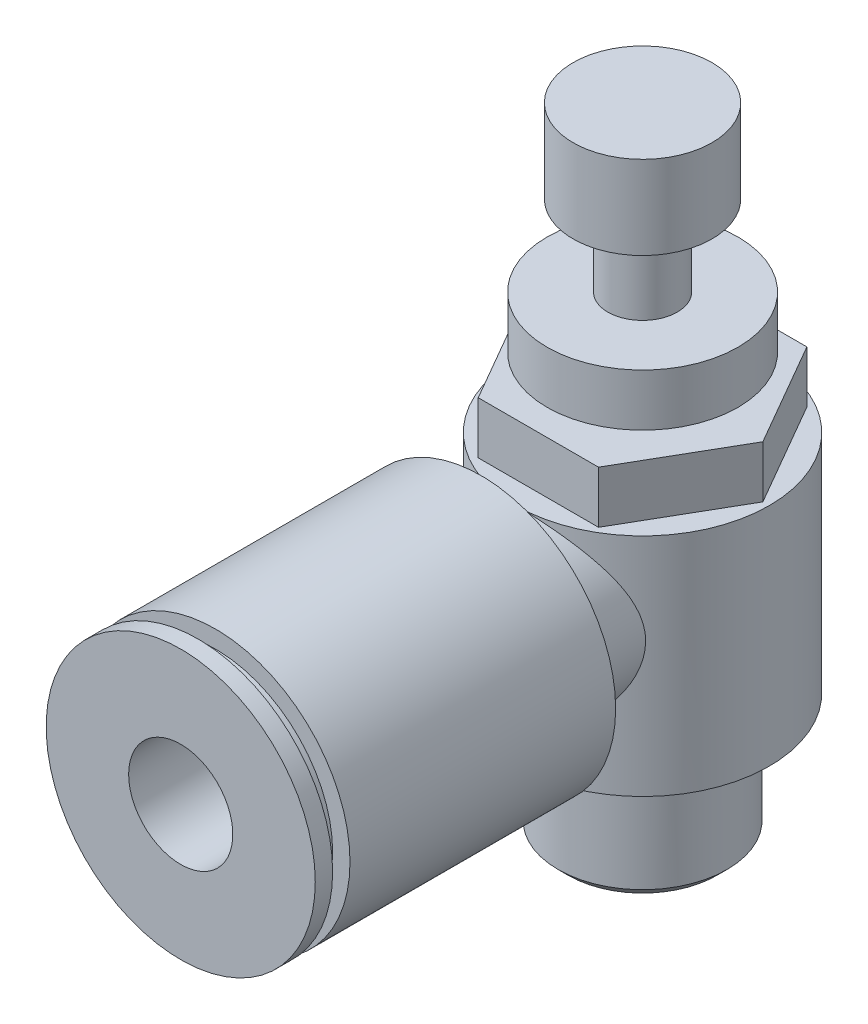
ISO-10303-21;
HEADER;
FILE_DESCRIPTION(('STEP AP214'),'2;1');
FILE_NAME('part.step','',(''),(''),'','','');
FILE_SCHEMA(('AUTOMOTIVE_DESIGN { 1 0 10303 214 1 1 1 1 }'));
ENDSEC;
DATA;
#1=APPLICATION_CONTEXT('core data for automotive mechanical design processes');
#2=APPLICATION_PROTOCOL_DEFINITION('international standard','automotive_design',2000,#1);
#3=PRODUCT_CONTEXT('',#1,'mechanical');
#4=PRODUCT('Part','Part','',(#3));
#5=PRODUCT_RELATED_PRODUCT_CATEGORY('part','',(#4));
#6=PRODUCT_DEFINITION_FORMATION('','',#4);
#7=PRODUCT_DEFINITION_CONTEXT('part definition',#1,'design');
#8=PRODUCT_DEFINITION('design','',#6,#7);
#9=PRODUCT_DEFINITION_SHAPE('','',#8);
#10=(LENGTH_UNIT() NAMED_UNIT(*) SI_UNIT(.MILLI.,.METRE.));
#11=(NAMED_UNIT(*) PLANE_ANGLE_UNIT() SI_UNIT($,.RADIAN.));
#12=(NAMED_UNIT(*) SI_UNIT($,.STERADIAN.) SOLID_ANGLE_UNIT());
#13=UNCERTAINTY_MEASURE_WITH_UNIT(LENGTH_MEASURE(1.E-05),#10,'distance_accuracy_value','');
#14=(GEOMETRIC_REPRESENTATION_CONTEXT(3) GLOBAL_UNCERTAINTY_ASSIGNED_CONTEXT((#13)) GLOBAL_UNIT_ASSIGNED_CONTEXT((#10,
#11,#12)) REPRESENTATION_CONTEXT('',''));
#15=CARTESIAN_POINT('',(0.,0.,0.));
#16=DIRECTION('',(0.,0.,1.));
#17=DIRECTION('',(1.,0.,0.));
#18=AXIS2_PLACEMENT_3D('',#15,#16,#17);
#19=CARTESIAN_POINT('',(4.04800210819405,21.7,4.));
#20=DIRECTION('',(0.,1.,0.));
#21=DIRECTION('',(0.,0.,-1.));
#22=AXIS2_PLACEMENT_3D('',#19,#20,#21);
#23=PLANE('',#22);
#24=CARTESIAN_POINT('',(0.,21.7,0.));
#25=DIRECTION('',(0.,-1.,0.));
#26=DIRECTION('',(0.,0.,-1.));
#27=AXIS2_PLACEMENT_3D('',#24,#25,#26);
#28=CIRCLE('',#27,4.);
#29=CARTESIAN_POINT('',(0.,21.7,-4.));
#30=VERTEX_POINT('',#29);
#31=EDGE_CURVE('E19',#30,#30,#28,.T.);
#32=ORIENTED_EDGE('',*,*,#31,.F.);
#33=EDGE_LOOP('',(#32));
#34=FACE_BOUND('',#33,.T.);
#35=ADVANCED_FACE('F16',(#34),#23,.T.);
#36=CARTESIAN_POINT('',(0.,16.9,0.));
#37=DIRECTION('',(0.,-1.,0.));
#38=DIRECTION('',(0.,0.,-1.));
#39=AXIS2_PLACEMENT_3D('',#36,#37,#38);
#40=CYLINDRICAL_SURFACE('',#39,4.);
#41=CARTESIAN_POINT('',(0.,16.9,0.));
#42=DIRECTION('',(0.,-1.,0.));
#43=DIRECTION('',(0.,0.,-1.));
#44=AXIS2_PLACEMENT_3D('',#41,#42,#43);
#45=CIRCLE('',#44,4.);
#46=CARTESIAN_POINT('',(0.,16.9,-4.));
#47=VERTEX_POINT('',#46);
#48=EDGE_CURVE('E210',#47,#47,#45,.T.);
#49=ORIENTED_EDGE('',*,*,#48,.F.);
#50=EDGE_LOOP('',(#49));
#51=FACE_BOUND('',#50,.T.);
#52=ORIENTED_EDGE('',*,*,#31,.T.);
#53=EDGE_LOOP('',(#52));
#54=FACE_BOUND('',#53,.T.);
#55=ADVANCED_FACE('F116',(#51,#54),#40,.T.);
#56=CARTESIAN_POINT('',(-3.06,-3.,9.6));
#57=CARTESIAN_POINT('',(-3.,-3.,9.6));
#58=CARTESIAN_POINT('',(3.,-3.,9.6));
#59=CARTESIAN_POINT('',(3.0606,-3.,9.6));
#60=B_SPLINE_CURVE_WITH_KNOTS('',1,(#56,#57,#58,#59),.UNSPECIFIED.,.F.,.F.,(2,1,1,2),(-0.01,0.,
1.,1.0101),.UNSPECIFIED.);
#61=DIRECTION('',(0.,1.,0.));
#62=VECTOR('',#61,1.);
#63=SURFACE_OF_LINEAR_EXTRUSION('',#60,#62);
#64=CARTESIAN_POINT('',(0.,0.,9.6));
#65=DIRECTION('',(0.,0.,-1.));
#66=DIRECTION('',(-1.,0.,0.));
#67=AXIS2_PLACEMENT_3D('',#64,#65,#66);
#68=CIRCLE('',#67,3.);
#69=CARTESIAN_POINT('',(-3.00000000000001,0.,9.6));
#70=VERTEX_POINT('',#69);
#71=EDGE_CURVE('E208',#70,#70,#68,.T.);
#72=ORIENTED_EDGE('',*,*,#71,.F.);
#73=EDGE_LOOP('',(#72));
#74=FACE_BOUND('',#73,.T.);
#75=ADVANCED_FACE('F112',(#74),#63,.T.);
#76=CARTESIAN_POINT('',(4.04800210819405,16.9,-4.));
#77=DIRECTION('',(0.,-1.,0.));
#78=DIRECTION('',(0.,0.,1.));
#79=AXIS2_PLACEMENT_3D('',#76,#77,#78);
#80=PLANE('',#79);
#81=CARTESIAN_POINT('',(0.,16.9,0.));
#82=DIRECTION('',(0.,-1.,0.));
#83=DIRECTION('',(1.,0.,0.));
#84=AXIS2_PLACEMENT_3D('',#81,#82,#83);
#85=CIRCLE('',#84,2.);
#86=CARTESIAN_POINT('',(2.,16.9,0.));
#87=VERTEX_POINT('',#86);
#88=EDGE_CURVE('E205',#87,#87,#85,.T.);
#89=ORIENTED_EDGE('',*,*,#88,.F.);
#90=EDGE_LOOP('',(#89));
#91=FACE_BOUND('',#90,.T.);
#92=ORIENTED_EDGE('',*,*,#48,.T.);
#93=EDGE_LOOP('',(#92));
#94=FACE_BOUND('',#93,.T.);
#95=ADVANCED_FACE('F115',(#91,#94),#80,.T.);
#96=CARTESIAN_POINT('',(0.,0.,26.6));
#97=DIRECTION('',(0.,0.,-1.));
#98=DIRECTION('',(-1.,0.,0.));
#99=AXIS2_PLACEMENT_3D('',#96,#97,#98);
#100=CYLINDRICAL_SURFACE('',#99,3.);
#101=CARTESIAN_POINT('',(0.,0.,26.6));
#102=DIRECTION('',(0.,0.,-1.));
#103=DIRECTION('',(-1.,0.,0.));
#104=AXIS2_PLACEMENT_3D('',#101,#102,#103);
#105=CIRCLE('',#104,3.);
#106=CARTESIAN_POINT('',(-3.,0.,26.6));
#107=VERTEX_POINT('',#106);
#108=EDGE_CURVE('E202',#107,#107,#105,.T.);
#109=ORIENTED_EDGE('',*,*,#108,.F.);
#110=EDGE_LOOP('',(#109));
#111=FACE_BOUND('',#110,.T.);
#112=ORIENTED_EDGE('',*,*,#71,.T.);
#113=EDGE_LOOP('',(#112));
#114=FACE_BOUND('',#113,.T.);
#115=ADVANCED_FACE('F216',(#111,#114),#100,.F.);
#116=CARTESIAN_POINT('',(0.,12.25,0.));
#117=DIRECTION('',(0.,-1.,0.));
#118=DIRECTION('',(1.,0.,0.));
#119=AXIS2_PLACEMENT_3D('',#116,#117,#118);
#120=CYLINDRICAL_SURFACE('',#119,2.);
#121=CARTESIAN_POINT('',(0.,12.25,0.));
#122=DIRECTION('',(0.,-1.,0.));
#123=DIRECTION('',(1.,0.,0.));
#124=AXIS2_PLACEMENT_3D('',#121,#122,#123);
#125=CIRCLE('',#124,2.);
#126=CARTESIAN_POINT('',(2.,12.25,0.));
#127=VERTEX_POINT('',#126);
#128=EDGE_CURVE('E199',#127,#127,#125,.T.);
#129=ORIENTED_EDGE('',*,*,#128,.F.);
#130=EDGE_LOOP('',(#129));
#131=FACE_BOUND('',#130,.T.);
#132=ORIENTED_EDGE('',*,*,#88,.T.);
#133=EDGE_LOOP('',(#132));
#134=FACE_BOUND('',#133,.T.);
#135=ADVANCED_FACE('F221',(#131,#134),#120,.T.);
#136=CARTESIAN_POINT('',(7.84300210826893,-7.75,26.6));
#137=DIRECTION('',(0.,0.,1.));
#138=DIRECTION('',(0.,1.,0.));
#139=AXIS2_PLACEMENT_3D('',#136,#137,#138);
#140=PLANE('',#139);
#141=ORIENTED_EDGE('',*,*,#108,.T.);
#142=EDGE_LOOP('',(#141));
#143=FACE_BOUND('',#142,.T.);
#144=CARTESIAN_POINT('',(0.,0.,26.6));
#145=DIRECTION('',(0.,0.,1.));
#146=DIRECTION('',(1.,0.,0.));
#147=AXIS2_PLACEMENT_3D('',#144,#145,#146);
#148=CIRCLE('',#147,7.75);
#149=CARTESIAN_POINT('',(7.75,0.,26.6));
#150=VERTEX_POINT('',#149);
#151=EDGE_CURVE('E196',#150,#150,#148,.F.);
#152=ORIENTED_EDGE('',*,*,#151,.F.);
#153=EDGE_LOOP('',(#152));
#154=FACE_BOUND('',#153,.T.);
#155=ADVANCED_FACE('F226',(#143,#154),#140,.T.);
#156=CARTESIAN_POINT('',(5.56600210823252,12.25,5.5));
#157=DIRECTION('',(0.,1.,0.));
#158=DIRECTION('',(0.,0.,-1.));
#159=AXIS2_PLACEMENT_3D('',#156,#157,#158);
#160=PLANE('',#159);
#161=ORIENTED_EDGE('',*,*,#128,.T.);
#162=EDGE_LOOP('',(#161));
#163=FACE_BOUND('',#162,.T.);
#164=CARTESIAN_POINT('',(0.,12.25,0.));
#165=DIRECTION('',(0.,-1.,0.));
#166=DIRECTION('',(1.,0.,0.));
#167=AXIS2_PLACEMENT_3D('',#164,#165,#166);
#168=CIRCLE('',#167,5.5);
#169=CARTESIAN_POINT('',(5.5,12.25,0.));
#170=VERTEX_POINT('',#169);
#171=EDGE_CURVE('E193',#170,#170,#168,.T.);
#172=ORIENTED_EDGE('',*,*,#171,.F.);
#173=EDGE_LOOP('',(#172));
#174=FACE_BOUND('',#173,.T.);
#175=ADVANCED_FACE('F232',(#163,#174),#160,.T.);
#176=CARTESIAN_POINT('',(0.,0.,26.6));
#177=DIRECTION('',(0.,0.,1.));
#178=DIRECTION('',(1.,0.,0.));
#179=AXIS2_PLACEMENT_3D('',#176,#177,#178);
#180=CYLINDRICAL_SURFACE('',#179,7.75);
#181=ORIENTED_EDGE('',*,*,#151,.T.);
#182=EDGE_LOOP('',(#181));
#183=FACE_BOUND('',#182,.T.);
#184=CARTESIAN_POINT('',(0.,0.,25.6));
#185=DIRECTION('',(0.,0.,1.));
#186=DIRECTION('',(1.,0.,0.));
#187=AXIS2_PLACEMENT_3D('',#184,#185,#186);
#188=CIRCLE('',#187,7.75);
#189=CARTESIAN_POINT('',(7.75,0.,25.6));
#190=VERTEX_POINT('',#189);
#191=EDGE_CURVE('E190',#190,#190,#188,.F.);
#192=ORIENTED_EDGE('',*,*,#191,.F.);
#193=EDGE_LOOP('',(#192));
#194=FACE_BOUND('',#193,.T.);
#195=ADVANCED_FACE('F239',(#183,#194),#180,.T.);
#196=CARTESIAN_POINT('',(0.,9.25,0.));
#197=DIRECTION('',(0.,-1.,0.));
#198=DIRECTION('',(1.,0.,0.));
#199=AXIS2_PLACEMENT_3D('',#196,#197,#198);
#200=CYLINDRICAL_SURFACE('',#199,5.5);
#201=CARTESIAN_POINT('',(0.,9.25,0.));
#202=DIRECTION('',(0.,-1.,0.));
#203=DIRECTION('',(1.,0.,0.));
#204=AXIS2_PLACEMENT_3D('',#201,#202,#203);
#205=CIRCLE('',#204,5.5);
#206=CARTESIAN_POINT('',(5.5,9.25,0.));
#207=VERTEX_POINT('',#206);
#208=EDGE_CURVE('E187',#207,#207,#205,.T.);
#209=ORIENTED_EDGE('',*,*,#208,.F.);
#210=EDGE_LOOP('',(#209));
#211=FACE_BOUND('',#210,.T.);
#212=ORIENTED_EDGE('',*,*,#171,.T.);
#213=EDGE_LOOP('',(#212));
#214=FACE_BOUND('',#213,.T.);
#215=ADVANCED_FACE('F243',(#211,#214),#200,.T.);
#216=CARTESIAN_POINT('',(7.84300210826894,7.75,25.6));
#217=DIRECTION('',(0.,0.,-1.));
#218=DIRECTION('',(0.,-1.,0.));
#219=AXIS2_PLACEMENT_3D('',#216,#217,#218);
#220=PLANE('',#219);
#221=CARTESIAN_POINT('',(0.,0.,25.6));
#222=DIRECTION('',(0.,0.,1.));
#223=DIRECTION('',(1.,0.,0.));
#224=AXIS2_PLACEMENT_3D('',#221,#222,#223);
#225=CIRCLE('',#224,6.75);
#226=CARTESIAN_POINT('',(6.75,0.,25.6));
#227=VERTEX_POINT('',#226);
#228=EDGE_CURVE('E184',#227,#227,#225,.F.);
#229=ORIENTED_EDGE('',*,*,#228,.F.);
#230=EDGE_LOOP('',(#229));
#231=FACE_BOUND('',#230,.T.);
#232=ORIENTED_EDGE('',*,*,#191,.T.);
#233=EDGE_LOOP('',(#232));
#234=FACE_BOUND('',#233,.T.);
#235=ADVANCED_FACE('F247',(#231,#234),#220,.T.);
#236=CARTESIAN_POINT('',(5.56600210823252,9.25,-5.5));
#237=DIRECTION('',(0.,-1.,0.));
#238=DIRECTION('',(0.,0.,1.));
#239=AXIS2_PLACEMENT_3D('',#236,#237,#238);
#240=PLANE('',#239);
#241=CARTESIAN_POINT('',(0.,9.25,0.));
#242=DIRECTION('',(0.,-1.,0.));
#243=DIRECTION('',(0.,0.,-1.));
#244=AXIS2_PLACEMENT_3D('',#241,#242,#243);
#245=CIRCLE('',#244,4.);
#246=CARTESIAN_POINT('',(0.,9.25,-4.));
#247=VERTEX_POINT('',#246);
#248=EDGE_CURVE('E181',#247,#247,#245,.T.);
#249=ORIENTED_EDGE('',*,*,#248,.F.);
#250=EDGE_LOOP('',(#249));
#251=FACE_BOUND('',#250,.T.);
#252=ORIENTED_EDGE('',*,*,#208,.T.);
#253=EDGE_LOOP('',(#252));
#254=FACE_BOUND('',#253,.T.);
#255=ADVANCED_FACE('F251',(#251,#254),#240,.T.);
#256=CARTESIAN_POINT('',(0.,0.,25.6));
#257=DIRECTION('',(0.,0.,1.));
#258=DIRECTION('',(1.,0.,0.));
#259=AXIS2_PLACEMENT_3D('',#256,#257,#258);
#260=CYLINDRICAL_SURFACE('',#259,6.75);
#261=ORIENTED_EDGE('',*,*,#228,.T.);
#262=EDGE_LOOP('',(#261));
#263=FACE_BOUND('',#262,.T.);
#264=CARTESIAN_POINT('',(0.,0.,24.6));
#265=DIRECTION('',(0.,0.,1.));
#266=DIRECTION('',(1.,0.,0.));
#267=AXIS2_PLACEMENT_3D('',#264,#265,#266);
#268=CIRCLE('',#267,6.75);
#269=CARTESIAN_POINT('',(6.75,0.,24.6));
#270=VERTEX_POINT('',#269);
#271=EDGE_CURVE('E178',#270,#270,#268,.F.);
#272=ORIENTED_EDGE('',*,*,#271,.F.);
#273=EDGE_LOOP('',(#272));
#274=FACE_BOUND('',#273,.T.);
#275=ADVANCED_FACE('F255',(#263,#274),#260,.T.);
#276=CARTESIAN_POINT('',(0.,8.25,0.));
#277=DIRECTION('',(0.,-1.,0.));
#278=DIRECTION('',(0.,0.,-1.));
#279=AXIS2_PLACEMENT_3D('',#276,#277,#278);
#280=CYLINDRICAL_SURFACE('',#279,4.);
#281=CARTESIAN_POINT('',(0.,8.25,0.));
#282=DIRECTION('',(0.,-1.,0.));
#283=DIRECTION('',(0.,0.,-1.));
#284=AXIS2_PLACEMENT_3D('',#281,#282,#283);
#285=CIRCLE('',#284,4.);
#286=CARTESIAN_POINT('',(0.,8.25,-4.));
#287=VERTEX_POINT('',#286);
#288=EDGE_CURVE('E175',#287,#287,#285,.T.);
#289=ORIENTED_EDGE('',*,*,#288,.F.);
#290=EDGE_LOOP('',(#289));
#291=FACE_BOUND('',#290,.T.);
#292=ORIENTED_EDGE('',*,*,#248,.T.);
#293=EDGE_LOOP('',(#292));
#294=FACE_BOUND('',#293,.T.);
#295=ADVANCED_FACE('F259',(#291,#294),#280,.T.);
#296=CARTESIAN_POINT('',(7.84300210826893,-7.75,24.6));
#297=DIRECTION('',(0.,0.,1.));
#298=DIRECTION('',(0.,1.,0.));
#299=AXIS2_PLACEMENT_3D('',#296,#297,#298);
#300=PLANE('',#299);
#301=ORIENTED_EDGE('',*,*,#271,.T.);
#302=EDGE_LOOP('',(#301));
#303=FACE_BOUND('',#302,.T.);
#304=CARTESIAN_POINT('',(0.,0.,24.6));
#305=DIRECTION('',(0.,0.,1.));
#306=DIRECTION('',(1.,0.,0.));
#307=AXIS2_PLACEMENT_3D('',#304,#305,#306);
#308=CIRCLE('',#307,7.75);
#309=CARTESIAN_POINT('',(7.75,0.,24.6));
#310=VERTEX_POINT('',#309);
#311=EDGE_CURVE('E93',#310,#310,#308,.F.);
#312=ORIENTED_EDGE('',*,*,#311,.F.);
#313=EDGE_LOOP('',(#312));
#314=FACE_BOUND('',#313,.T.);
#315=ADVANCED_FACE('F263',(#303,#314),#300,.T.);
#316=CARTESIAN_POINT('',(-7.01134166903882,8.25,-6.));
#317=DIRECTION('',(0.,1.,0.));
#318=DIRECTION('',(0.,0.,1.));
#319=AXIS2_PLACEMENT_3D('',#316,#317,#318);
#320=PLANE('',#319);
#321=ORIENTED_EDGE('',*,*,#288,.T.);
#322=EDGE_LOOP('',(#321));
#323=FACE_BOUND('',#322,.T.);
#324=DIRECTION('',(-1.,0.,0.));
#325=VECTOR('',#324,1.);
#326=CARTESIAN_POINT('',(0.,8.25,6.));
#327=LINE('',#326,#325);
#328=CARTESIAN_POINT('',(3.46410161513775,8.25,6.));
#329=VERTEX_POINT('',#328);
#330=CARTESIAN_POINT('',(-3.46410161513775,8.25,6.));
#331=VERTEX_POINT('',#330);
#332=EDGE_CURVE('E81',#329,#331,#327,.T.);
#333=ORIENTED_EDGE('',*,*,#332,.F.);
#334=DIRECTION('',(-0.5,0.,0.866025403784438));
#335=VECTOR('',#334,1.);
#336=CARTESIAN_POINT('',(5.19615242270663,8.25,3.));
#337=LINE('',#336,#335);
#338=CARTESIAN_POINT('',(6.92820310527251,8.25,-2.16511547189088E-07));
#339=VERTEX_POINT('',#338);
#340=EDGE_CURVE('E75',#339,#329,#337,.T.);
#341=ORIENTED_EDGE('',*,*,#340,.F.);
#342=DIRECTION('',(0.5,0.,0.866025403784438));
#343=VECTOR('',#342,1.);
#344=CARTESIAN_POINT('',(5.19615242270663,8.25,-3.));
#345=LINE('',#344,#343);
#346=CARTESIAN_POINT('',(3.46410161513775,8.25,-6.));
#347=VERTEX_POINT('',#346);
#348=EDGE_CURVE('E78',#347,#339,#345,.T.);
#349=ORIENTED_EDGE('',*,*,#348,.F.);
#350=DIRECTION('',(1.,0.,0.));
#351=VECTOR('',#350,1.);
#352=CARTESIAN_POINT('',(0.,8.25,-6.));
#353=LINE('',#352,#351);
#354=CARTESIAN_POINT('',(-3.46410161513775,8.25,-6.));
#355=VERTEX_POINT('',#354);
#356=EDGE_CURVE('E352',#355,#347,#353,.T.);
#357=ORIENTED_EDGE('',*,*,#356,.F.);
#358=DIRECTION('',(0.5,0.,-0.866025403784438));
#359=VECTOR('',#358,1.);
#360=CARTESIAN_POINT('',(-5.19615242270663,8.25,-3.));
#361=LINE('',#360,#359);
#362=CARTESIAN_POINT('',(-6.92820310527251,8.25,-2.16511547405929E-07));
#363=VERTEX_POINT('',#362);
#364=EDGE_CURVE('E357',#363,#355,#361,.T.);
#365=ORIENTED_EDGE('',*,*,#364,.F.);
#366=DIRECTION('',(-0.5,0.,-0.866025403784438));
#367=VECTOR('',#366,1.);
#368=CARTESIAN_POINT('',(-5.19615242270663,8.25,3.));
#369=LINE('',#368,#367);
#370=EDGE_CURVE('E362',#331,#363,#369,.T.);
#371=ORIENTED_EDGE('',*,*,#370,.F.);
#372=EDGE_LOOP('',(#333,#341,#349,#357,#365,#371));
#373=FACE_BOUND('',#372,.T.);
#374=ADVANCED_FACE('F77',(#323,#373),#320,.T.);
#375=CARTESIAN_POINT('',(0.,0.,24.6));
#376=DIRECTION('',(0.,0.,1.));
#377=DIRECTION('',(1.,0.,0.));
#378=AXIS2_PLACEMENT_3D('',#375,#376,#377);
#379=CYLINDRICAL_SURFACE('',#378,7.75);
#380=ORIENTED_EDGE('',*,*,#311,.T.);
#381=EDGE_LOOP('',(#380));
#382=FACE_BOUND('',#381,.T.);
#383=CARTESIAN_POINT('',(0.,0.,9.3));
#384=DIRECTION('',(0.,0.,1.));
#385=DIRECTION('',(1.,0.,0.));
#386=AXIS2_PLACEMENT_3D('',#383,#384,#385);
#387=CIRCLE('',#386,7.75);
#388=CARTESIAN_POINT('',(7.75,0.,9.3));
#389=VERTEX_POINT('',#388);
#390=EDGE_CURVE('E169',#389,#389,#387,.F.);
#391=ORIENTED_EDGE('',*,*,#390,.F.);
#392=EDGE_LOOP('',(#391));
#393=FACE_BOUND('',#392,.T.);
#394=ADVANCED_FACE('F270',(#382,#393),#379,.T.);
#395=CARTESIAN_POINT('',(6.92820323027551,5.25,0.));
#396=DIRECTION('',(0.866025403784438,0.,-0.5));
#397=DIRECTION('',(-0.5,0.,-0.866025403784438));
#398=AXIS2_PLACEMENT_3D('',#395,#396,#397);
#399=PLANE('',#398);
#400=CARTESIAN_POINT('',(3.46410161513776,5.25,-6.));
#401=CARTESIAN_POINT('',(3.60843918243517,5.25,-5.75));
#402=CARTESIAN_POINT('',(3.75277674973257,5.25,-5.5));
#403=CARTESIAN_POINT('',(4.04145188432739,5.25,-5.));
#404=CARTESIAN_POINT('',(4.18578945162479,5.25,-4.75));
#405=CARTESIAN_POINT('',(4.4744645862196,5.25,-4.25));
#406=CARTESIAN_POINT('',(4.61880215351701,5.25,-4.));
#407=CARTESIAN_POINT('',(4.90747728811182,5.25,-3.5));
#408=CARTESIAN_POINT('',(5.05181485540923,5.25,-3.25));
#409=CARTESIAN_POINT('',(5.34048999000404,5.25,-2.75));
#410=CARTESIAN_POINT('',(5.48482755730145,5.25,-2.5));
#411=CARTESIAN_POINT('',(5.77350269189626,5.25,-2.));
#412=CARTESIAN_POINT('',(5.91784025919367,5.25,-1.75));
#413=CARTESIAN_POINT('',(6.20651539378848,5.25,-1.25));
#414=CARTESIAN_POINT('',(6.35085296108588,5.25,-0.999999999999999));
#415=CARTESIAN_POINT('',(6.6395280956807,5.25,-0.5));
#416=CARTESIAN_POINT('',(6.7838656629781,5.25,-0.250000000000001));
#417=CARTESIAN_POINT('',(6.92820323027551,5.25,0.));
#418=B_SPLINE_CURVE_WITH_KNOTS('',3,(#400,#401,#402,#403,#404,#405,#406,#407,#408,#409,#410,
#411,#412,#413,#414,#415,#416,#417),.UNSPECIFIED.,.F.,.F.,(4,2,2,2,2,2,2,2,4),(0.,
0.866025403784437,1.73205080756888,2.59807621135332,3.46410161513775,4.33012701892219,
5.19615242270663,6.06217782649107,6.92820323027551),.UNSPECIFIED.);
#419=CARTESIAN_POINT('',(3.46410161513776,5.25,-6.));
#420=VERTEX_POINT('',#419);
#421=CARTESIAN_POINT('',(6.92820316777329,5.25,-1.08257021402824E-07));
#422=VERTEX_POINT('',#421);
#423=EDGE_CURVE('E172',#420,#422,#418,.T.);
#424=ORIENTED_EDGE('',*,*,#423,.F.);
#425=DIRECTION('',(0.,1.,0.));
#426=VECTOR('',#425,1.);
#427=CARTESIAN_POINT('',(3.46410161513776,5.25,-6.));
#428=LINE('',#427,#426);
#429=EDGE_CURVE('E91',#347,#420,#428,.F.);
#430=ORIENTED_EDGE('',*,*,#429,.F.);
#431=ORIENTED_EDGE('',*,*,#348,.T.);
#432=DIRECTION('',(0.,1.,0.));
#433=VECTOR('',#432,1.);
#434=CARTESIAN_POINT('',(6.92820323027551,5.25,0.));
#435=LINE('',#434,#433);
#436=EDGE_CURVE('E85',#422,#339,#435,.T.);
#437=ORIENTED_EDGE('',*,*,#436,.F.);
#438=EDGE_LOOP('',(#424,#430,#431,#437));
#439=FACE_BOUND('',#438,.T.);
#440=ADVANCED_FACE('F88',(#439),#399,.T.);
#441=CARTESIAN_POINT('',(3.46410161513775,5.25,6.));
#442=DIRECTION('',(0.866025403784438,0.,0.5));
#443=DIRECTION('',(0.5,0.,-0.866025403784438));
#444=AXIS2_PLACEMENT_3D('',#441,#442,#443);
#445=PLANE('',#444);
#446=CARTESIAN_POINT('',(6.92820323027551,5.25,0.));
#447=CARTESIAN_POINT('',(6.7838656629781,5.25,0.25));
#448=CARTESIAN_POINT('',(6.6395280956807,5.25,0.5));
#449=CARTESIAN_POINT('',(6.35085296108588,5.25,1.));
#450=CARTESIAN_POINT('',(6.20651539378848,5.25,1.25));
#451=CARTESIAN_POINT('',(5.91784025919366,5.25,1.75));
#452=CARTESIAN_POINT('',(5.77350269189626,5.25,2.));
#453=CARTESIAN_POINT('',(5.48482755730144,5.25,2.5));
#454=CARTESIAN_POINT('',(5.34048999000404,5.25,2.75));
#455=CARTESIAN_POINT('',(5.05181485540922,5.25,3.25));
#456=CARTESIAN_POINT('',(4.90747728811182,5.25,3.5));
#457=CARTESIAN_POINT('',(4.618802153517,5.25,4.));
#458=CARTESIAN_POINT('',(4.4744645862196,5.25,4.25));
#459=CARTESIAN_POINT('',(4.18578945162478,5.25,4.75));
#460=CARTESIAN_POINT('',(4.04145188432738,5.25,5.));
#461=CARTESIAN_POINT('',(3.75277674973256,5.25,5.5));
#462=CARTESIAN_POINT('',(3.60843918243516,5.25,5.75));
#463=CARTESIAN_POINT('',(3.46410161513775,5.25,6.));
#464=B_SPLINE_CURVE_WITH_KNOTS('',3,(#446,#447,#448,#449,#450,#451,#452,#453,#454,#455,#456,
#457,#458,#459,#460,#461,#462,#463),.UNSPECIFIED.,.F.,.F.,(4,2,2,2,2,2,2,2,4),(0.,
0.866025403784439,1.73205080756888,2.59807621135332,3.46410161513776,4.3301270189222,
5.19615242270663,6.06217782649107,6.92820323027551),.UNSPECIFIED.);
#465=CARTESIAN_POINT('',(3.46410161513775,5.25,6.));
#466=VERTEX_POINT('',#465);
#467=EDGE_CURVE('E97',#422,#466,#464,.T.);
#468=ORIENTED_EDGE('',*,*,#467,.F.);
#469=ORIENTED_EDGE('',*,*,#436,.T.);
#470=ORIENTED_EDGE('',*,*,#340,.T.);
#471=DIRECTION('',(0.,1.,0.));
#472=VECTOR('',#471,1.);
#473=CARTESIAN_POINT('',(3.46410161513775,5.25,6.));
#474=LINE('',#473,#472);
#475=EDGE_CURVE('E100',#466,#329,#474,.T.);
#476=ORIENTED_EDGE('',*,*,#475,.F.);
#477=EDGE_LOOP('',(#468,#469,#470,#476));
#478=FACE_BOUND('',#477,.T.);
#479=ADVANCED_FACE('F95',(#478),#445,.T.);
#480=CARTESIAN_POINT('',(-3.46410161513776,5.25,6.));
#481=DIRECTION('',(0.,0.,1.));
#482=DIRECTION('',(1.,0.,0.));
#483=AXIS2_PLACEMENT_3D('',#480,#481,#482);
#484=PLANE('',#483);
#485=DIRECTION('',(-1.,0.,0.));
#486=VECTOR('',#485,1.);
#487=CARTESIAN_POINT('',(7.3,5.25,6.));
#488=LINE('',#487,#486);
#489=CARTESIAN_POINT('',(-3.46410161513776,5.25,6.));
#490=VERTEX_POINT('',#489);
#491=EDGE_CURVE('E322',#466,#490,#488,.T.);
#492=ORIENTED_EDGE('',*,*,#491,.F.);
#493=ORIENTED_EDGE('',*,*,#475,.T.);
#494=ORIENTED_EDGE('',*,*,#332,.T.);
#495=DIRECTION('',(0.,1.,0.));
#496=VECTOR('',#495,1.);
#497=CARTESIAN_POINT('',(-3.46410161513775,5.25,6.));
#498=LINE('',#497,#496);
#499=EDGE_CURVE('E359',#490,#331,#498,.T.);
#500=ORIENTED_EDGE('',*,*,#499,.F.);
#501=EDGE_LOOP('',(#492,#493,#494,#500));
#502=FACE_BOUND('',#501,.T.);
#503=ADVANCED_FACE('F279',(#502),#484,.T.);
#504=CARTESIAN_POINT('',(-6.92820323027551,5.25,0.));
#505=DIRECTION('',(-0.866025403784438,0.,0.5));
#506=DIRECTION('',(0.5,0.,0.866025403784438));
#507=AXIS2_PLACEMENT_3D('',#504,#505,#506);
#508=PLANE('',#507);
#509=CARTESIAN_POINT('',(-3.46410161513775,5.25,6.));
#510=CARTESIAN_POINT('',(-3.60843918243516,5.25,5.75));
#511=CARTESIAN_POINT('',(-3.75277674973256,5.25,5.5));
#512=CARTESIAN_POINT('',(-4.04145188432738,5.25,5.));
#513=CARTESIAN_POINT('',(-4.18578945162478,5.25,4.75));
#514=CARTESIAN_POINT('',(-4.4744645862196,5.25,4.25));
#515=CARTESIAN_POINT('',(-4.618802153517,5.25,4.));
#516=CARTESIAN_POINT('',(-4.90747728811182,5.25,3.5));
#517=CARTESIAN_POINT('',(-5.05181485540922,5.25,3.25));
#518=CARTESIAN_POINT('',(-5.34048999000404,5.25,2.75));
#519=CARTESIAN_POINT('',(-5.48482755730144,5.25,2.5));
#520=CARTESIAN_POINT('',(-5.77350269189626,5.25,2.));
#521=CARTESIAN_POINT('',(-5.91784025919366,5.25,1.75));
#522=CARTESIAN_POINT('',(-6.20651539378848,5.25,1.25));
#523=CARTESIAN_POINT('',(-6.35085296108588,5.25,1.));
#524=CARTESIAN_POINT('',(-6.63952809568069,5.25,0.499999999999999));
#525=CARTESIAN_POINT('',(-6.7838656629781,5.25,0.249999999999999));
#526=CARTESIAN_POINT('',(-6.92820323027551,5.25,0.));
#527=B_SPLINE_CURVE_WITH_KNOTS('',3,(#509,#510,#511,#512,#513,#514,#515,#516,#517,#518,#519,
#520,#521,#522,#523,#524,#525,#526),.UNSPECIFIED.,.F.,.F.,(4,2,2,2,2,2,2,2,4),(0.,
0.866025403784438,1.73205080756888,2.59807621135332,3.46410161513776,4.33012701892219,
5.19615242270663,6.06217782649107,6.92820323027551),.UNSPECIFIED.);
#528=CARTESIAN_POINT('',(-6.92820316777329,5.25,1.08257021402824E-07));
#529=VERTEX_POINT('',#528);
#530=EDGE_CURVE('E323',#490,#529,#527,.T.);
#531=ORIENTED_EDGE('',*,*,#530,.F.);
#532=ORIENTED_EDGE('',*,*,#499,.T.);
#533=ORIENTED_EDGE('',*,*,#370,.T.);
#534=DIRECTION('',(0.,1.,0.));
#535=VECTOR('',#534,1.);
#536=CARTESIAN_POINT('',(-6.92820323027551,5.25,0.));
#537=LINE('',#536,#535);
#538=EDGE_CURVE('E354',#529,#363,#537,.T.);
#539=ORIENTED_EDGE('',*,*,#538,.F.);
#540=EDGE_LOOP('',(#531,#532,#533,#539));
#541=FACE_BOUND('',#540,.T.);
#542=ADVANCED_FACE('F282',(#541),#508,.T.);
#543=CARTESIAN_POINT('',(-3.46410161513775,5.25,-6.));
#544=DIRECTION('',(-0.866025403784438,0.,-0.5));
#545=DIRECTION('',(-0.5,0.,0.866025403784438));
#546=AXIS2_PLACEMENT_3D('',#543,#544,#545);
#547=PLANE('',#546);
#548=CARTESIAN_POINT('',(-6.92820323027551,5.25,0.));
#549=CARTESIAN_POINT('',(-6.7838656629781,5.25,-0.25));
#550=CARTESIAN_POINT('',(-6.63952809568069,5.25,-0.5));
#551=CARTESIAN_POINT('',(-6.35085296108588,5.25,-0.999999999999999));
#552=CARTESIAN_POINT('',(-6.20651539378848,5.25,-1.25));
#553=CARTESIAN_POINT('',(-5.91784025919366,5.25,-1.75));
#554=CARTESIAN_POINT('',(-5.77350269189626,5.25,-2.));
#555=CARTESIAN_POINT('',(-5.48482755730145,5.25,-2.5));
#556=CARTESIAN_POINT('',(-5.34048999000404,5.25,-2.75));
#557=CARTESIAN_POINT('',(-5.05181485540922,5.25,-3.25));
#558=CARTESIAN_POINT('',(-4.90747728811182,5.25,-3.5));
#559=CARTESIAN_POINT('',(-4.618802153517,5.25,-4.));
#560=CARTESIAN_POINT('',(-4.4744645862196,5.25,-4.25));
#561=CARTESIAN_POINT('',(-4.18578945162479,5.25,-4.75));
#562=CARTESIAN_POINT('',(-4.04145188432738,5.25,-5.));
#563=CARTESIAN_POINT('',(-3.75277674973257,5.25,-5.5));
#564=CARTESIAN_POINT('',(-3.60843918243516,5.25,-5.75));
#565=CARTESIAN_POINT('',(-3.46410161513775,5.25,-6.));
#566=B_SPLINE_CURVE_WITH_KNOTS('',3,(#548,#549,#550,#551,#552,#553,#554,#555,#556,#557,#558,
#559,#560,#561,#562,#563,#564,#565),.UNSPECIFIED.,.F.,.F.,(4,2,2,2,2,2,2,2,4),(0.,
0.86602540378444,1.73205080756888,2.59807621135332,3.46410161513776,4.3301270189222,
5.19615242270663,6.06217782649107,6.92820323027551),.UNSPECIFIED.);
#567=CARTESIAN_POINT('',(-3.46410161513775,5.25,-6.));
#568=VERTEX_POINT('',#567);
#569=EDGE_CURVE('E332',#529,#568,#566,.T.);
#570=ORIENTED_EDGE('',*,*,#569,.F.);
#571=ORIENTED_EDGE('',*,*,#538,.T.);
#572=ORIENTED_EDGE('',*,*,#364,.T.);
#573=DIRECTION('',(0.,1.,0.));
#574=VECTOR('',#573,1.);
#575=CARTESIAN_POINT('',(-3.46410161513775,5.25,-6.));
#576=LINE('',#575,#574);
#577=EDGE_CURVE('E40',#568,#355,#576,.T.);
#578=ORIENTED_EDGE('',*,*,#577,.F.);
#579=EDGE_LOOP('',(#570,#571,#572,#578));
#580=FACE_BOUND('',#579,.T.);
#581=ADVANCED_FACE('F286',(#580),#547,.T.);
#582=CARTESIAN_POINT('',(3.46410161513776,5.25,-6.));
#583=DIRECTION('',(0.,0.,-1.));
#584=DIRECTION('',(-1.,0.,0.));
#585=AXIS2_PLACEMENT_3D('',#582,#583,#584);
#586=PLANE('',#585);
#587=DIRECTION('',(-1.,0.,0.));
#588=VECTOR('',#587,1.);
#589=CARTESIAN_POINT('',(7.3,5.25,-6.));
#590=LINE('',#589,#588);
#591=EDGE_CURVE('E168',#568,#420,#590,.F.);
#592=ORIENTED_EDGE('',*,*,#591,.F.);
#593=ORIENTED_EDGE('',*,*,#577,.T.);
#594=ORIENTED_EDGE('',*,*,#356,.T.);
#595=ORIENTED_EDGE('',*,*,#429,.T.);
#596=EDGE_LOOP('',(#592,#593,#594,#595));
#597=FACE_BOUND('',#596,.T.);
#598=ADVANCED_FACE('F290',(#597),#586,.T.);
#599=CARTESIAN_POINT('',(7.84300210826894,7.75,9.3));
#600=DIRECTION('',(0.,0.,-1.));
#601=DIRECTION('',(0.,-1.,0.));
#602=AXIS2_PLACEMENT_3D('',#599,#600,#601);
#603=PLANE('',#602);
#604=CARTESIAN_POINT('',(0.,0.,9.3));
#605=DIRECTION('',(0.,0.,1.));
#606=DIRECTION('',(1.,0.,0.));
#607=AXIS2_PLACEMENT_3D('',#604,#605,#606);
#608=CIRCLE('',#607,5.25);
#609=CARTESIAN_POINT('',(5.25,0.,9.3));
#610=VERTEX_POINT('',#609);
#611=EDGE_CURVE('E165',#610,#610,#608,.F.);
#612=ORIENTED_EDGE('',*,*,#611,.F.);
#613=EDGE_LOOP('',(#612));
#614=FACE_BOUND('',#613,.T.);
#615=ORIENTED_EDGE('',*,*,#390,.T.);
#616=EDGE_LOOP('',(#615));
#617=FACE_BOUND('',#616,.T.);
#618=ADVANCED_FACE('F293',(#614,#617),#603,.T.);
#619=CARTESIAN_POINT('',(7.38760210826612,5.25,7.3));
#620=DIRECTION('',(0.,1.,0.));
#621=DIRECTION('',(0.,0.,-1.));
#622=AXIS2_PLACEMENT_3D('',#619,#620,#621);
#623=PLANE('',#622);
#624=ORIENTED_EDGE('',*,*,#569,.T.);
#625=ORIENTED_EDGE('',*,*,#591,.T.);
#626=ORIENTED_EDGE('',*,*,#423,.T.);
#627=ORIENTED_EDGE('',*,*,#467,.T.);
#628=ORIENTED_EDGE('',*,*,#491,.T.);
#629=ORIENTED_EDGE('',*,*,#530,.T.);
#630=EDGE_LOOP('',(#624,#625,#626,#627,#628,#629));
#631=FACE_BOUND('',#630,.T.);
#632=CARTESIAN_POINT('',(0.,5.25,0.));
#633=DIRECTION('',(0.,-1.,0.));
#634=DIRECTION('',(0.,0.,-1.));
#635=AXIS2_PLACEMENT_3D('',#632,#633,#634);
#636=CIRCLE('',#635,7.3);
#637=CARTESIAN_POINT('',(0.,5.25,7.3));
#638=VERTEX_POINT('',#637);
#639=EDGE_CURVE('E163',#638,#638,#636,.T.);
#640=ORIENTED_EDGE('',*,*,#639,.F.);
#641=EDGE_LOOP('',(#640));
#642=FACE_BOUND('',#641,.T.);
#643=ADVANCED_FACE('F297',(#631,#642),#623,.T.);
#644=CARTESIAN_POINT('',(0.,0.,9.3));
#645=DIRECTION('',(0.,0.,1.));
#646=DIRECTION('',(1.,0.,0.));
#647=AXIS2_PLACEMENT_3D('',#644,#645,#646);
#648=CYLINDRICAL_SURFACE('',#647,5.25);
#649=ORIENTED_EDGE('',*,*,#611,.T.);
#650=EDGE_LOOP('',(#649));
#651=FACE_BOUND('',#650,.T.);
#652=CARTESIAN_POINT('',(0.,5.25,7.3));
#653=CARTESIAN_POINT('',(0.129550621350862,5.24999902547532,7.29999906460579));
#654=CARTESIAN_POINT('',(0.259119848122385,5.2451968979198,7.29654336509262));
#655=CARTESIAN_POINT('',(0.517240949472566,5.22606204847841,7.28280037609426));
#656=CARTESIAN_POINT('',(0.645792266927527,5.21172442935931,7.27250957624506));
#657=CARTESIAN_POINT('',(0.901012942516516,5.1737170011698,7.2453206243386));
#658=CARTESIAN_POINT('',(1.02767886855809,5.15003192616239,7.22841166410863));
#659=CARTESIAN_POINT('',(1.27804093415714,5.09368108223173,7.18837217276169));
#660=CARTESIAN_POINT('',(1.40173574521633,5.06101137432822,7.16523891292707));
#661=CARTESIAN_POINT('',(1.64455285335095,4.98737787171699,7.1134209130566));
#662=CARTESIAN_POINT('',(1.76369889441963,4.94646718433818,7.08477176880145));
#663=CARTESIAN_POINT('',(1.99761849672852,4.85672063891104,7.0224069534788));
#664=CARTESIAN_POINT('',(2.11239031599181,4.80788166341663,6.98868928982938));
#665=CARTESIAN_POINT('',(2.44917535212084,4.65030872721406,6.88091262606352));
#666=CARTESIAN_POINT('',(2.66395571743225,4.53042690771171,6.80016408082259));
#667=CARTESIAN_POINT('',(3.0895131867346,4.2529723255449,6.61840574883454));
#668=CARTESIAN_POINT('',(3.29818081698012,4.09297485824256,6.51622524928062));
#669=CARTESIAN_POINT('',(3.68768171658566,3.74588506061446,6.30398241501702));
#670=CARTESIAN_POINT('',(3.86847078612107,3.55875059923507,6.19390796153032));
#671=CARTESIAN_POINT('',(4.13293663862219,3.24114622036226,6.0185428986292));
#672=CARTESIAN_POINT('',(4.2262256466178,3.11854539342981,5.95322757446136));
#673=CARTESIAN_POINT('',(4.40211104804817,2.86491563565593,5.82437005319317));
#674=CARTESIAN_POINT('',(4.4847044787487,2.73388438452173,5.76082835120342));
#675=CARTESIAN_POINT('',(4.63855724688885,2.46381660414011,5.63768451193502));
#676=CARTESIAN_POINT('',(4.70983221702197,2.32479148394947,5.57807700859368));
#677=CARTESIAN_POINT('',(4.84047585403534,2.03887850112625,5.4650935393303));
#678=CARTESIAN_POINT('',(4.89984642810417,1.89199190275624,5.41171657579467));
#679=CARTESIAN_POINT('',(5.02435736155294,1.53776554927667,5.29673043499859));
#680=CARTESIAN_POINT('',(5.08424237574246,1.32726301710426,5.23878018695136));
#681=CARTESIAN_POINT('',(5.15432944478983,1.00378344081875,5.16952174810936));
#682=CARTESIAN_POINT('',(5.17439641691486,0.894727953841008,5.14938597288402));
#683=CARTESIAN_POINT('',(5.20766919312788,0.674575613136318,5.11573524791335));
#684=CARTESIAN_POINT('',(5.22087773906135,0.563479593588094,5.10221765249127));
#685=CARTESIAN_POINT('',(5.2402461406001,0.33923179091478,5.0823239283958));
#686=CARTESIAN_POINT('',(5.24635516639926,0.226071004433324,5.0759993054083));
#687=CARTESIAN_POINT('',(5.25122325978402,-0.000577797718331175,5.07096315637886));
#688=CARTESIAN_POINT('',(5.24998256901173,-0.114065802507713,5.07225138004367));
#689=CARTESIAN_POINT('',(5.24017599473671,-0.340437565249052,5.08238171554773));
#690=CARTESIAN_POINT('',(5.2316064931086,-0.453320997029144,5.09122755846955));
#691=CARTESIAN_POINT('',(5.20731618815556,-0.67756063406347,5.11606852179657));
#692=CARTESIAN_POINT('',(5.19159180898979,-0.788916046948013,5.13206721696068));
#693=CARTESIAN_POINT('',(5.1509303012587,-1.02283001646585,5.17289502782847));
#694=CARTESIAN_POINT('',(5.12509933198958,-1.14508619434785,5.19856692817812));
#695=CARTESIAN_POINT('',(5.06528877340727,-1.38591959266082,5.25686181836957));
#696=CARTESIAN_POINT('',(5.03130370310172,-1.50449427767262,5.28948948205823));
#697=CARTESIAN_POINT('',(4.91776596878957,-1.85423193217647,5.3959518150787));
#698=CARTESIAN_POINT('',(4.82667284947006,-2.07917484390121,5.47832068131733));
#699=CARTESIAN_POINT('',(4.65292953793719,-2.43676229649143,5.62569973684905));
#700=CARTESIAN_POINT('',(4.57791450677223,-2.57481275986681,5.6871078105096));
#701=CARTESIAN_POINT('',(4.41659244652402,-2.84264463755134,5.81327673368414));
#702=CARTESIAN_POINT('',(4.33028210067713,-2.97242360630323,5.87803856460899));
#703=CARTESIAN_POINT('',(4.14678659167348,-3.22348685294323,6.00889991452106));
#704=CARTESIAN_POINT('',(4.04959267799047,-3.34476416615758,6.07500047437914));
#705=CARTESIAN_POINT('',(3.8447094199187,-3.57838500086911,6.20669299145576));
#706=CARTESIAN_POINT('',(3.7370212013028,-3.6907294782903,6.27228500241552));
#707=CARTESIAN_POINT('',(3.51019573948585,-3.90715505612679,6.40201373914638));
#708=CARTESIAN_POINT('',(3.39094787849941,-4.01113435939351,6.46612724517661));
#709=CARTESIAN_POINT('',(3.1422878310698,-4.20877021196099,6.59055040128227));
#710=CARTESIAN_POINT('',(3.01287453344419,-4.30242563006265,6.65085963421036));
#711=CARTESIAN_POINT('',(2.74454424444036,-4.47835617349701,6.76600024691518));
#712=CARTESIAN_POINT('',(2.605642350946,-4.56064877624108,6.82084000251061));
#713=CARTESIAN_POINT('',(2.31884691822281,-4.71293766359939,6.92359179576655));
#714=CARTESIAN_POINT('',(2.17095709718265,-4.78293898696979,6.97150667081975));
#715=CARTESIAN_POINT('',(1.90600596213073,-4.89332753559847,7.04776555181852));
#716=CARTESIAN_POINT('',(1.79072231029626,-4.9367114506088,7.07798201307432));
#717=CARTESIAN_POINT('',(1.55627055609614,-5.01555657011161,7.13319804901173));
#718=CARTESIAN_POINT('',(1.4371033209938,-5.05101952976876,7.15819877933977));
#719=CARTESIAN_POINT('',(1.19581109639206,-5.11351497692977,7.20243357911112));
#720=CARTESIAN_POINT('',(1.07369308327069,-5.14056558419333,7.22168003944192));
#721=CARTESIAN_POINT('',(0.827092504516728,-5.18595436002114,7.25405877276754));
#722=CARTESIAN_POINT('',(0.702611045083011,-5.20429650485068,7.26719383615816));
#723=CARTESIAN_POINT('',(0.481751927516507,-5.22873596299686,7.28471875460584));
#724=CARTESIAN_POINT('',(0.385681225775782,-5.23670221237416,7.29044143335835));
#725=CARTESIAN_POINT('',(0.193077185139861,-5.24733511598439,7.29808277927422));
#726=CARTESIAN_POINT('',(0.0965437588614088,-5.25000072623564,7.30000069707481));
#727=CARTESIAN_POINT('',(-0.129550621350856,-5.24999902547534,7.29999906460581));
#728=CARTESIAN_POINT('',(-0.259119848122377,-5.2451968979198,7.29654336509262));
#729=CARTESIAN_POINT('',(-0.517240949472558,-5.22606204847841,7.28280037609426));
#730=CARTESIAN_POINT('',(-0.64579226692752,-5.21172442935931,7.27250957624506));
#731=CARTESIAN_POINT('',(-0.90101294251651,-5.1737170011698,7.2453206243386));
#732=CARTESIAN_POINT('',(-1.02767886855809,-5.15003192616239,7.22841166410863));
#733=CARTESIAN_POINT('',(-1.27804093415714,-5.09368108223173,7.18837217276169));
#734=CARTESIAN_POINT('',(-1.40173574521633,-5.06101137432822,7.16523891292707));
#735=CARTESIAN_POINT('',(-1.64455285335095,-4.98737787171699,7.1134209130566));
#736=CARTESIAN_POINT('',(-1.76369889441963,-4.94646718433818,7.08477176880145));
#737=CARTESIAN_POINT('',(-1.99761849672852,-4.85672063891104,7.0224069534788));
#738=CARTESIAN_POINT('',(-2.11239031599181,-4.80788166341663,6.98868928982938));
#739=CARTESIAN_POINT('',(-2.44917535212084,-4.65030872721406,6.88091262606351));
#740=CARTESIAN_POINT('',(-2.66395571743225,-4.53042690771171,6.80016408082259));
#741=CARTESIAN_POINT('',(-3.0895131867346,-4.2529723255449,6.61840574883454));
#742=CARTESIAN_POINT('',(-3.29818081698011,-4.09297485824256,6.51622524928062));
#743=CARTESIAN_POINT('',(-3.68768171658566,-3.74588506061446,6.30398241501703));
#744=CARTESIAN_POINT('',(-3.86847078612107,-3.55875059923507,6.19390796153032));
#745=CARTESIAN_POINT('',(-4.13293663862219,-3.24114622036226,6.0185428986292));
#746=CARTESIAN_POINT('',(-4.2262256466178,-3.11854539342981,5.95322757446136));
#747=CARTESIAN_POINT('',(-4.40211104804817,-2.86491563565592,5.82437005319317));
#748=CARTESIAN_POINT('',(-4.4847044787487,-2.73388438452173,5.76082835120342));
#749=CARTESIAN_POINT('',(-4.63855724688885,-2.46381660414011,5.63768451193502));
#750=CARTESIAN_POINT('',(-4.70983221702197,-2.32479148394947,5.57807700859367));
#751=CARTESIAN_POINT('',(-4.84047585403534,-2.03887850112625,5.4650935393303));
#752=CARTESIAN_POINT('',(-4.89984642810417,-1.89199190275624,5.41171657579467));
#753=CARTESIAN_POINT('',(-5.02435736155294,-1.53776554927667,5.29673043499859));
#754=CARTESIAN_POINT('',(-5.08424237574246,-1.32726301710427,5.23878018695135));
#755=CARTESIAN_POINT('',(-5.15432944478983,-1.00378344081875,5.16952174810936));
#756=CARTESIAN_POINT('',(-5.17439641691486,-0.894727953841012,5.14938597288402));
#757=CARTESIAN_POINT('',(-5.20766919312788,-0.67457561313632,5.11573524791335));
#758=CARTESIAN_POINT('',(-5.22087773906135,-0.563479593588095,5.10221765249127));
#759=CARTESIAN_POINT('',(-5.2402461406001,-0.339231790914781,5.0823239283958));
#760=CARTESIAN_POINT('',(-5.24635516639926,-0.226071004433325,5.0759993054083));
#761=CARTESIAN_POINT('',(-5.25122325978402,0.000577797718330782,5.07096315637886));
#762=CARTESIAN_POINT('',(-5.24998256901173,0.114065802507712,5.07225138004367));
#763=CARTESIAN_POINT('',(-5.24017599473671,0.340437565249051,5.08238171554773));
#764=CARTESIAN_POINT('',(-5.2316064931086,0.453320997029143,5.09122755846954));
#765=CARTESIAN_POINT('',(-5.20731618815556,0.677560634063469,5.11606852179657));
#766=CARTESIAN_POINT('',(-5.19159180898979,0.788916046948013,5.13206721696068));
#767=CARTESIAN_POINT('',(-5.1509303012587,1.02283001646585,5.17289502782847));
#768=CARTESIAN_POINT('',(-5.12509933198958,1.14508619434786,5.19856692817812));
#769=CARTESIAN_POINT('',(-5.06528877340727,1.38591959266082,5.25686181836957));
#770=CARTESIAN_POINT('',(-5.03130370310172,1.50449427767262,5.28948948205823));
#771=CARTESIAN_POINT('',(-4.91776596878957,1.85423193217647,5.39595181507871));
#772=CARTESIAN_POINT('',(-4.82667284947006,2.07917484390121,5.47832068131733));
#773=CARTESIAN_POINT('',(-4.65292953793719,2.43676229649143,5.62569973684905));
#774=CARTESIAN_POINT('',(-4.57791450677223,2.57481275986681,5.6871078105096));
#775=CARTESIAN_POINT('',(-4.41659244652402,2.84264463755134,5.81327673368414));
#776=CARTESIAN_POINT('',(-4.33028210067713,2.97242360630323,5.87803856460899));
#777=CARTESIAN_POINT('',(-4.14678659167348,3.22348685294323,6.00889991452106));
#778=CARTESIAN_POINT('',(-4.04959267799046,3.34476416615758,6.07500047437914));
#779=CARTESIAN_POINT('',(-3.84470941991869,3.57838500086911,6.20669299145576));
#780=CARTESIAN_POINT('',(-3.7370212013028,3.6907294782903,6.27228500241552));
#781=CARTESIAN_POINT('',(-3.51019573948585,3.90715505612679,6.40201373914638));
#782=CARTESIAN_POINT('',(-3.39094787849941,4.01113435939351,6.46612724517661));
#783=CARTESIAN_POINT('',(-3.1422878310698,4.20877021196099,6.59055040128227));
#784=CARTESIAN_POINT('',(-3.01287453344419,4.30242563006265,6.65085963421036));
#785=CARTESIAN_POINT('',(-2.74454424444036,4.47835617349701,6.76600024691518));
#786=CARTESIAN_POINT('',(-2.605642350946,4.56064877624108,6.82084000251061));
#787=CARTESIAN_POINT('',(-2.31884691822281,4.71293766359939,6.92359179576655));
#788=CARTESIAN_POINT('',(-2.17095709718265,4.78293898696979,6.97150667081975));
#789=CARTESIAN_POINT('',(-1.90600596213073,4.89332753559847,7.04776555181852));
#790=CARTESIAN_POINT('',(-1.79072231029626,4.9367114506088,7.07798201307432));
#791=CARTESIAN_POINT('',(-1.55627055609613,5.01555657011161,7.13319804901173));
#792=CARTESIAN_POINT('',(-1.4371033209938,5.05101952976876,7.15819877933977));
#793=CARTESIAN_POINT('',(-1.19581109639207,5.11351497692977,7.20243357911112));
#794=CARTESIAN_POINT('',(-1.07369308327069,5.14056558419333,7.22168003944192));
#795=CARTESIAN_POINT('',(-0.827092504516729,5.18595436002114,7.25405877276754));
#796=CARTESIAN_POINT('',(-0.702611045083011,5.20429650485068,7.26719383615816));
#797=CARTESIAN_POINT('',(-0.481751927516508,5.22873596299686,7.28471875460584));
#798=CARTESIAN_POINT('',(-0.385681225775785,5.23670221237417,7.29044143335835));
#799=CARTESIAN_POINT('',(-0.193077185139862,5.24733511598439,7.29808277927422));
#800=CARTESIAN_POINT('',(-0.0965437588614078,5.25000072623562,7.3000006970748));
#801=CARTESIAN_POINT('',(0.,5.25,7.3));
#802=B_SPLINE_CURVE_WITH_KNOTS('',3,(#652,#653,#654,#655,#656,#657,#658,#659,#660,#661,#662,
#663,#664,#665,#666,#667,#668,#669,#670,#671,#672,#673,#674,#675,#676,#677,#678,#679,#680,#681,
#682,#683,#684,#685,#686,#687,#688,#689,#690,#691,#692,#693,#694,#695,#696,#697,#698,#699,#700,
#701,#702,#703,#704,#705,#706,#707,#708,#709,#710,#711,#712,#713,#714,#715,#716,#717,#718,#719,
#720,#721,#722,#723,#724,#725,#726,#727,#728,#729,#730,#731,#732,#733,#734,#735,#736,#737,#738,
#739,#740,#741,#742,#743,#744,#745,#746,#747,#748,#749,#750,#751,#752,#753,#754,#755,#756,#757,
#758,#759,#760,#761,#762,#763,#764,#765,#766,#767,#768,#769,#770,#771,#772,#773,#774,#775,#776,
#777,#778,#779,#780,#781,#782,#783,#784,#785,#786,#787,#788,#789,#790,#791,#792,#793,#794,#795,
#796,#797,#798,#799,#800,#801),.UNSPECIFIED.,.T.,.F.,(4,2,2,2,2,2,2,2,2,2,2,2,2,2,2,2,2,2,2,2,2,
2,2,2,2,2,2,2,2,2,2,2,2,2,2,2,2,2,2,2,2,2,2,2,2,2,2,2,2,2,2,2,2,2,2,2,2,2,2,2,2,2,2,2,2,2,2,2,2,
2,2,2,2,2,4),(0.,0.388550325340145,0.777300356429223,1.1666879253413,1.55624647973469,
1.94337060087628,2.33064731168366,3.104256300005,3.94766142840664,4.79239027458281,
5.29390759804603,5.79556354876591,6.2965204862856,6.7973971018745,7.47360676747755,
7.81136078883397,8.14897967952062,8.48900118186936,8.8290115051394,9.16918978343239,
9.50953826194547,9.89165839815242,10.2740361095554,11.0395075372255,11.5450710460184,
12.0507833433158,12.5569051993819,13.0629728210467,13.5744798657585,14.0860429012486,
14.5968101094274,15.1073674394666,15.487476672963,15.8675015962232,16.2467022039509,
16.6257295025832,16.9152280982133,17.2047837060831,17.5933340314232,17.9820840625123,
18.3714716314244,18.7610301858178,19.1481543069594,19.5354310177667,20.3090400060881,
21.1524451344897,21.9971739806659,22.4986913041291,23.000347254849,23.5013041923687,
24.0021808079576,24.6783904735606,25.0161444949171,25.3537633856037,25.6937848879524,
26.0337952112225,26.3739734895155,26.7143219680285,27.0964421042355,27.4788198156385,
28.2442912433086,28.7498547521015,29.2555670493989,29.761688905465,30.2677565271298,
30.7792635718416,31.2908266073317,31.8015938155104,32.3121511455497,32.6922603790461,
33.0722853023063,33.451485910034,33.8305132086662,34.1200118042963,34.4095674121661),.UNSPECIFIED.);
#803=EDGE_CURVE('E31',#638,#638,#802,.T.);
#804=ORIENTED_EDGE('',*,*,#803,.F.);
#805=EDGE_LOOP('',(#804));
#806=FACE_BOUND('',#805,.T.);
#807=ADVANCED_FACE('F152',(#651,#806),#648,.T.);
#808=CARTESIAN_POINT('',(0.,-7.75,0.));
#809=DIRECTION('',(0.,-1.,0.));
#810=DIRECTION('',(0.,0.,-1.));
#811=AXIS2_PLACEMENT_3D('',#808,#809,#810);
#812=CYLINDRICAL_SURFACE('',#811,7.3);
#813=CARTESIAN_POINT('',(0.,-7.75,0.));
#814=DIRECTION('',(0.,-1.,0.));
#815=DIRECTION('',(0.,0.,-1.));
#816=AXIS2_PLACEMENT_3D('',#813,#814,#815);
#817=CIRCLE('',#816,7.3);
#818=CARTESIAN_POINT('',(0.,-7.75,-7.3));
#819=VERTEX_POINT('',#818);
#820=EDGE_CURVE('E162',#819,#819,#817,.T.);
#821=ORIENTED_EDGE('',*,*,#820,.F.);
#822=EDGE_LOOP('',(#821));
#823=FACE_BOUND('',#822,.T.);
#824=ORIENTED_EDGE('',*,*,#639,.T.);
#825=ORIENTED_EDGE('',*,*,#803,.T.);
#826=EDGE_LOOP('',(#824,#825));
#827=FACE_BOUND('',#826,.T.);
#828=ADVANCED_FACE('F147',(#823,#827),#812,.T.);
#829=CARTESIAN_POINT('',(7.38760210826612,-7.75,-7.3));
#830=DIRECTION('',(0.,-1.,0.));
#831=DIRECTION('',(0.,0.,1.));
#832=AXIS2_PLACEMENT_3D('',#829,#830,#831);
#833=PLANE('',#832);
#834=CARTESIAN_POINT('',(0.,-7.75,0.));
#835=DIRECTION('',(0.,-1.,0.));
#836=DIRECTION('',(0.,0.,-1.));
#837=AXIS2_PLACEMENT_3D('',#834,#835,#836);
#838=CIRCLE('',#837,4.865);
#839=CARTESIAN_POINT('',(0.,-7.75,-4.865));
#840=VERTEX_POINT('',#839);
#841=EDGE_CURVE('E560',#840,#840,#838,.T.);
#842=ORIENTED_EDGE('',*,*,#841,.F.);
#843=EDGE_LOOP('',(#842));
#844=FACE_BOUND('',#843,.T.);
#845=ORIENTED_EDGE('',*,*,#820,.T.);
#846=EDGE_LOOP('',(#845));
#847=FACE_BOUND('',#846,.T.);
#848=ADVANCED_FACE('F143',(#844,#847),#833,.T.);
#849=CARTESIAN_POINT('',(0.,-14.12,0.));
#850=DIRECTION('',(0.,-1.,0.));
#851=DIRECTION('',(0.,0.,-1.));
#852=AXIS2_PLACEMENT_3D('',#849,#850,#851);
#853=CYLINDRICAL_SURFACE('',#852,4.865);
#854=ORIENTED_EDGE('',*,*,#841,.T.);
#855=EDGE_LOOP('',(#854));
#856=FACE_BOUND('',#855,.T.);
#857=CARTESIAN_POINT('',(0.,-14.12,0.));
#858=DIRECTION('',(0.,-1.,0.));
#859=DIRECTION('',(0.,0.,1.));
#860=AXIS2_PLACEMENT_3D('',#857,#858,#859);
#861=CIRCLE('',#860,4.865);
#862=CARTESIAN_POINT('',(0.,-14.12,4.865));
#863=VERTEX_POINT('',#862);
#864=EDGE_CURVE('E24',#863,#863,#861,.T.);
#865=ORIENTED_EDGE('',*,*,#864,.F.);
#866=EDGE_LOOP('',(#865));
#867=FACE_BOUND('',#866,.T.);
#868=ADVANCED_FACE('F136',(#856,#867),#853,.T.);
#869=CARTESIAN_POINT('',(4.33642210820387,-14.7,-4.285));
#870=DIRECTION('',(0.,-1.,0.));
#871=DIRECTION('',(0.,0.,1.));
#872=AXIS2_PLACEMENT_3D('',#869,#870,#871);
#873=PLANE('',#872);
#874=CARTESIAN_POINT('',(0.,-14.7,0.));
#875=DIRECTION('',(0.,1.,0.));
#876=DIRECTION('',(0.,0.,1.));
#877=AXIS2_PLACEMENT_3D('',#874,#875,#876);
#878=CIRCLE('',#877,4.285);
#879=CARTESIAN_POINT('',(0.,-14.7,4.285));
#880=VERTEX_POINT('',#879);
#881=EDGE_CURVE('E11',#880,#880,#878,.T.);
#882=ORIENTED_EDGE('',*,*,#881,.F.);
#883=EDGE_LOOP('',(#882));
#884=FACE_BOUND('',#883,.T.);
#885=ADVANCED_FACE('F130',(#884),#873,.T.);
#886=CARTESIAN_POINT('',(0.,-14.7,0.));
#887=DIRECTION('',(0.,1.,0.));
#888=DIRECTION('',(0.,0.,1.));
#889=AXIS2_PLACEMENT_3D('',#886,#887,#888);
#890=CONICAL_SURFACE('',#889,4.285,0.785398163397447);
#891=ORIENTED_EDGE('',*,*,#881,.T.);
#892=EDGE_LOOP('',(#891));
#893=FACE_BOUND('',#892,.T.);
#894=ORIENTED_EDGE('',*,*,#864,.T.);
#895=EDGE_LOOP('',(#894));
#896=FACE_BOUND('',#895,.T.);
#897=ADVANCED_FACE('F128',(#893,#896),#890,.T.);
#898=CLOSED_SHELL('',(#35,#55,#75,#95,#115,#135,#155,#175,#195,#215,#235,#255,#275,#295,#315,
#374,#394,#440,#479,#503,#542,#581,#598,#618,#643,#807,#828,#848,#868,#885,#897));
#899=MANIFOLD_SOLID_BREP('B1',#898);
#900=ADVANCED_BREP_SHAPE_REPRESENTATION('',(#18,#899),#14);
#901=SHAPE_DEFINITION_REPRESENTATION(#9,#900);
ENDSEC;
END-ISO-10303-21;
